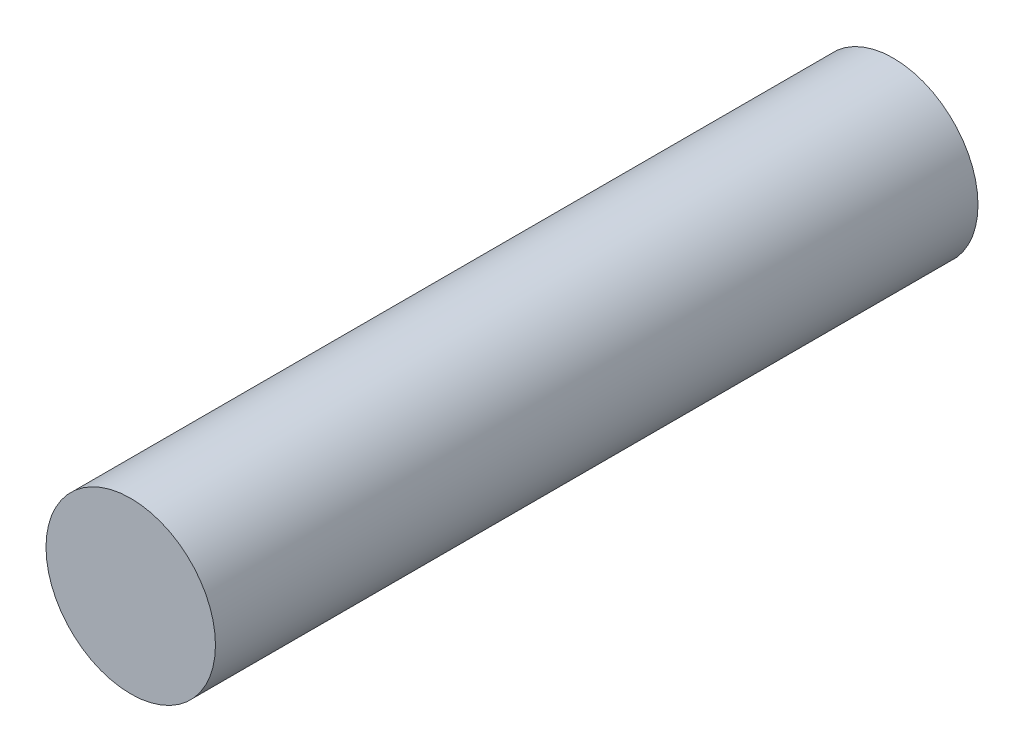
ISO-10303-21;
HEADER;
FILE_DESCRIPTION(('STEP AP214'),'2;1');
FILE_NAME('part.step','',(''),(''),'','','');
FILE_SCHEMA(('AUTOMOTIVE_DESIGN { 1 0 10303 214 1 1 1 1 }'));
ENDSEC;
DATA;
#1=APPLICATION_CONTEXT('core data for automotive mechanical design processes');
#2=APPLICATION_PROTOCOL_DEFINITION('international standard','automotive_design',2000,#1);
#3=PRODUCT_CONTEXT('',#1,'mechanical');
#4=PRODUCT('Part','Part','',(#3));
#5=PRODUCT_RELATED_PRODUCT_CATEGORY('part','',(#4));
#6=PRODUCT_DEFINITION_FORMATION('','',#4);
#7=PRODUCT_DEFINITION_CONTEXT('part definition',#1,'design');
#8=PRODUCT_DEFINITION('design','',#6,#7);
#9=PRODUCT_DEFINITION_SHAPE('','',#8);
#10=(LENGTH_UNIT() NAMED_UNIT(*) SI_UNIT(.MILLI.,.METRE.));
#11=(NAMED_UNIT(*) PLANE_ANGLE_UNIT() SI_UNIT($,.RADIAN.));
#12=(NAMED_UNIT(*) SI_UNIT($,.STERADIAN.) SOLID_ANGLE_UNIT());
#13=UNCERTAINTY_MEASURE_WITH_UNIT(LENGTH_MEASURE(1.E-05),#10,'distance_accuracy_value','');
#14=(GEOMETRIC_REPRESENTATION_CONTEXT(3) GLOBAL_UNCERTAINTY_ASSIGNED_CONTEXT((#13)) GLOBAL_UNIT_ASSIGNED_CONTEXT((#10,
#11,#12)) REPRESENTATION_CONTEXT('',''));
#15=CARTESIAN_POINT('',(0.,0.,0.));
#16=DIRECTION('',(0.,0.,1.));
#17=DIRECTION('',(1.,0.,0.));
#18=AXIS2_PLACEMENT_3D('',#15,#16,#17);
#19=CARTESIAN_POINT('',(0.,0.,114.3));
#20=DIRECTION('',(0.,0.,-1.));
#21=DIRECTION('',(-1.,0.,0.));
#22=AXIS2_PLACEMENT_3D('',#19,#20,#21);
#23=CYLINDRICAL_SURFACE('',#22,12.7);
#24=CARTESIAN_POINT('',(0.,0.,114.3));
#25=DIRECTION('',(0.,0.,1.));
#26=DIRECTION('',(1.,0.,0.));
#27=AXIS2_PLACEMENT_3D('',#24,#25,#26);
#28=CIRCLE('',#27,12.7);
#29=CARTESIAN_POINT('',(12.7,0.,114.3));
#30=VERTEX_POINT('',#29);
#31=EDGE_CURVE('E10',#30,#30,#28,.T.);
#32=ORIENTED_EDGE('',*,*,#31,.F.);
#33=EDGE_LOOP('',(#32));
#34=FACE_BOUND('',#33,.T.);
#35=CARTESIAN_POINT('',(0.,0.,0.));
#36=DIRECTION('',(0.,0.,1.));
#37=DIRECTION('',(1.,0.,0.));
#38=AXIS2_PLACEMENT_3D('',#35,#36,#37);
#39=CIRCLE('',#38,12.7);
#40=CARTESIAN_POINT('',(12.7,0.,0.));
#41=VERTEX_POINT('',#40);
#42=EDGE_CURVE('E40',#41,#41,#39,.T.);
#43=ORIENTED_EDGE('',*,*,#42,.T.);
#44=EDGE_LOOP('',(#43));
#45=FACE_BOUND('',#44,.T.);
#46=ADVANCED_FACE('F37',(#34,#45),#23,.T.);
#47=CARTESIAN_POINT('',(0.,0.,114.3));
#48=DIRECTION('',(0.,0.,1.));
#49=DIRECTION('',(1.,0.,0.));
#50=AXIS2_PLACEMENT_3D('',#47,#48,#49);
#51=PLANE('',#50);
#52=ORIENTED_EDGE('',*,*,#31,.T.);
#53=EDGE_LOOP('',(#52));
#54=FACE_BOUND('',#53,.T.);
#55=ADVANCED_FACE('F54',(#54),#51,.T.);
#56=CARTESIAN_POINT('',(0.,0.,0.));
#57=DIRECTION('',(0.,0.,1.));
#58=DIRECTION('',(1.,0.,0.));
#59=AXIS2_PLACEMENT_3D('',#56,#57,#58);
#60=PLANE('',#59);
#61=ORIENTED_EDGE('',*,*,#42,.F.);
#62=EDGE_LOOP('',(#61));
#63=FACE_BOUND('',#62,.T.);
#64=ADVANCED_FACE('F52',(#63),#60,.F.);
#65=CLOSED_SHELL('',(#46,#55,#64));
#66=MANIFOLD_SOLID_BREP('B2',#65);
#67=ADVANCED_BREP_SHAPE_REPRESENTATION('',(#18,#66),#14);
#68=SHAPE_DEFINITION_REPRESENTATION(#9,#67);
ENDSEC;
END-ISO-10303-21;
